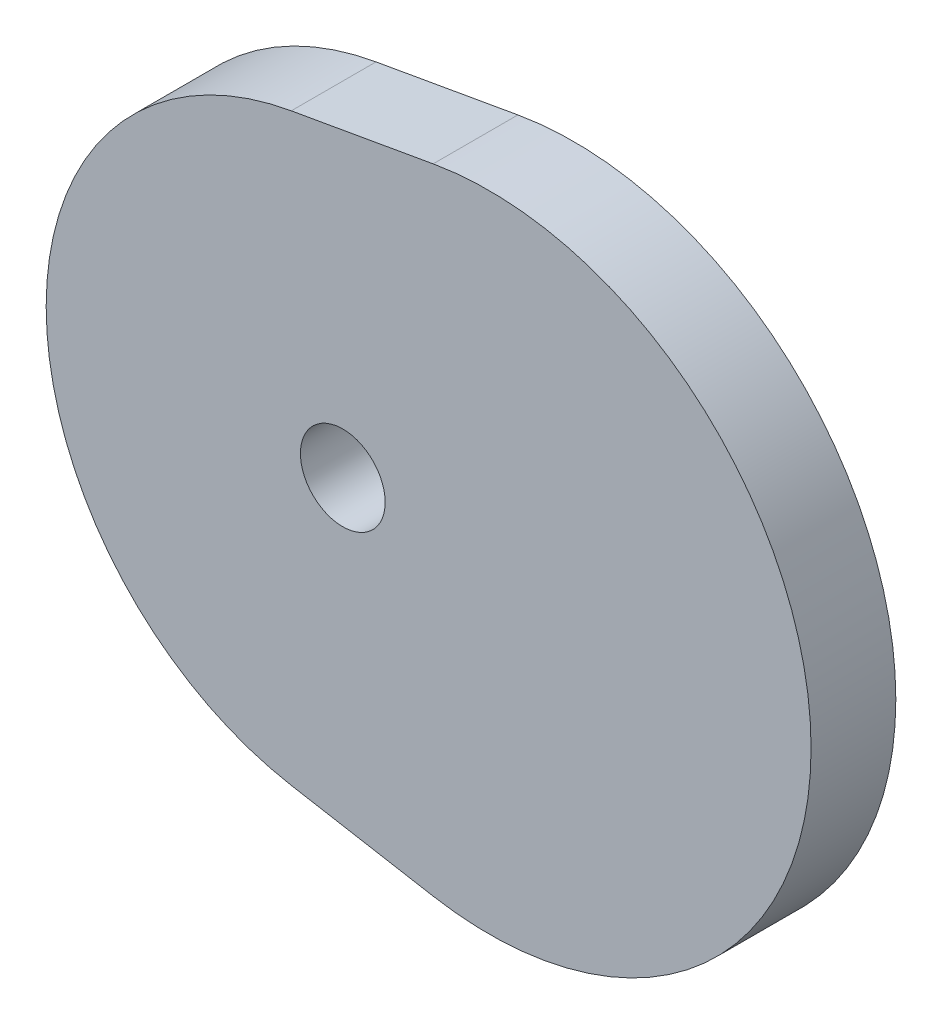
ISO-10303-21;
HEADER;
FILE_DESCRIPTION(('STEP AP214'),'2;1');
FILE_NAME('part.step','',(''),(''),'','','');
FILE_SCHEMA(('AUTOMOTIVE_DESIGN { 1 0 10303 214 1 1 1 1 }'));
ENDSEC;
DATA;
#1=APPLICATION_CONTEXT('core data for automotive mechanical design processes');
#2=APPLICATION_PROTOCOL_DEFINITION('international standard','automotive_design',2000,#1);
#3=PRODUCT_CONTEXT('',#1,'mechanical');
#4=PRODUCT('Part','Part','',(#3));
#5=PRODUCT_RELATED_PRODUCT_CATEGORY('part','',(#4));
#6=PRODUCT_DEFINITION_FORMATION('','',#4);
#7=PRODUCT_DEFINITION_CONTEXT('part definition',#1,'design');
#8=PRODUCT_DEFINITION('design','',#6,#7);
#9=PRODUCT_DEFINITION_SHAPE('','',#8);
#10=(LENGTH_UNIT() NAMED_UNIT(*) SI_UNIT(.MILLI.,.METRE.));
#11=(NAMED_UNIT(*) PLANE_ANGLE_UNIT() SI_UNIT($,.RADIAN.));
#12=(NAMED_UNIT(*) SI_UNIT($,.STERADIAN.) SOLID_ANGLE_UNIT());
#13=UNCERTAINTY_MEASURE_WITH_UNIT(LENGTH_MEASURE(1.E-05),#10,'distance_accuracy_value','');
#14=(GEOMETRIC_REPRESENTATION_CONTEXT(3) GLOBAL_UNCERTAINTY_ASSIGNED_CONTEXT((#13)) GLOBAL_UNIT_ASSIGNED_CONTEXT((#10,
#11,#12)) REPRESENTATION_CONTEXT('',''));
#15=CARTESIAN_POINT('',(0.,0.,0.));
#16=DIRECTION('',(0.,0.,1.));
#17=DIRECTION('',(1.,0.,0.));
#18=AXIS2_PLACEMENT_3D('',#15,#16,#17);
#19=CARTESIAN_POINT('',(8.87362414285556,0.,10.));
#20=DIRECTION('',(0.,0.,-1.));
#21=DIRECTION('',(-1.,0.,0.));
#22=AXIS2_PLACEMENT_3D('',#19,#20,#21);
#23=CYLINDRICAL_SURFACE('',#22,35.);
#24=CARTESIAN_POINT('',(8.87362414285556,0.,0.));
#25=DIRECTION('',(0.,0.,1.));
#26=DIRECTION('',(1.,0.,0.));
#27=AXIS2_PLACEMENT_3D('',#24,#25,#26);
#28=CIRCLE('',#27,35.);
#29=CARTESIAN_POINT('',(2.79593792451287,34.4682713554273,0.));
#30=VERTEX_POINT('',#29);
#31=CARTESIAN_POINT('',(2.79593792451287,-34.4682713554273,0.));
#32=VERTEX_POINT('',#31);
#33=EDGE_CURVE('E99',#30,#32,#28,.T.);
#34=ORIENTED_EDGE('',*,*,#33,.T.);
#35=DIRECTION('',(0.,0.,-1.));
#36=VECTOR('',#35,1.);
#37=CARTESIAN_POINT('',(2.79593792451287,-34.4682713554273,10.));
#38=LINE('',#37,#36);
#39=CARTESIAN_POINT('',(2.79593792451287,-34.4682713554273,10.));
#40=VERTEX_POINT('',#39);
#41=EDGE_CURVE('E11',#40,#32,#38,.T.);
#42=ORIENTED_EDGE('',*,*,#41,.F.);
#43=CARTESIAN_POINT('',(8.87362414285556,0.,10.));
#44=DIRECTION('',(0.,0.,1.));
#45=DIRECTION('',(1.,0.,0.));
#46=AXIS2_PLACEMENT_3D('',#43,#44,#45);
#47=CIRCLE('',#46,35.);
#48=CARTESIAN_POINT('',(2.79593792451287,34.4682713554273,10.));
#49=VERTEX_POINT('',#48);
#50=EDGE_CURVE('E87',#49,#40,#47,.T.);
#51=ORIENTED_EDGE('',*,*,#50,.F.);
#52=DIRECTION('',(0.,0.,-1.));
#53=VECTOR('',#52,1.);
#54=CARTESIAN_POINT('',(2.79593792451287,34.4682713554273,10.));
#55=LINE('',#54,#53);
#56=EDGE_CURVE('E95',#49,#30,#55,.T.);
#57=ORIENTED_EDGE('',*,*,#56,.T.);
#58=EDGE_LOOP('',(#34,#42,#51,#57));
#59=FACE_BOUND('',#58,.T.);
#60=ADVANCED_FACE('F36',(#59),#23,.T.);
#61=CARTESIAN_POINT('',(2.79593792451287,-34.4682713554273,10.));
#62=DIRECTION('',(0.173648177666934,0.984807753012207,0.));
#63=DIRECTION('',(-0.984807753012207,0.173648177666934,0.));
#64=AXIS2_PLACEMENT_3D('',#61,#62,#63);
#65=PLANE('',#64);
#66=DIRECTION('',(0.984807753012207,-0.173648177666934,0.));
#67=VECTOR('',#66,1.);
#68=CARTESIAN_POINT('',(2.79593792451287,-34.4682713554273,0.));
#69=LINE('',#68,#67);
#70=CARTESIAN_POINT('',(19.5376697257204,-37.4202903757651,0.));
#71=VERTEX_POINT('',#70);
#72=EDGE_CURVE('E91',#32,#71,#69,.T.);
#73=ORIENTED_EDGE('',*,*,#72,.T.);
#74=DIRECTION('',(0.,0.,-1.));
#75=VECTOR('',#74,1.);
#76=CARTESIAN_POINT('',(19.5376697257204,-37.4202903757651,10.));
#77=LINE('',#76,#75);
#78=CARTESIAN_POINT('',(19.5376697257204,-37.4202903757651,10.));
#79=VERTEX_POINT('',#78);
#80=EDGE_CURVE('E44',#79,#71,#77,.T.);
#81=ORIENTED_EDGE('',*,*,#80,.F.);
#82=DIRECTION('',(0.984807753012207,-0.173648177666934,0.));
#83=VECTOR('',#82,1.);
#84=CARTESIAN_POINT('',(2.79593792451287,-34.4682713554273,10.));
#85=LINE('',#84,#83);
#86=EDGE_CURVE('E82',#40,#79,#85,.T.);
#87=ORIENTED_EDGE('',*,*,#86,.F.);
#88=ORIENTED_EDGE('',*,*,#41,.T.);
#89=EDGE_LOOP('',(#73,#81,#87,#88));
#90=FACE_BOUND('',#89,.T.);
#91=ADVANCED_FACE('F90',(#90),#65,.F.);
#92=CARTESIAN_POINT('',(26.1358765449132,0.,10.));
#93=DIRECTION('',(0.,0.,-1.));
#94=DIRECTION('',(-1.,0.,0.));
#95=AXIS2_PLACEMENT_3D('',#92,#93,#94);
#96=CYLINDRICAL_SURFACE('',#95,37.997558672044);
#97=CARTESIAN_POINT('',(26.1358765449132,0.,0.));
#98=DIRECTION('',(0.,0.,1.));
#99=DIRECTION('',(-1.,0.,0.));
#100=AXIS2_PLACEMENT_3D('',#97,#98,#99);
#101=CIRCLE('',#100,37.997558672044);
#102=CARTESIAN_POINT('',(19.5376697257204,37.4202903757651,0.));
#103=VERTEX_POINT('',#102);
#104=EDGE_CURVE('E69',#71,#103,#101,.T.);
#105=ORIENTED_EDGE('',*,*,#104,.T.);
#106=DIRECTION('',(0.,0.,-1.));
#107=VECTOR('',#106,1.);
#108=CARTESIAN_POINT('',(19.5376697257204,37.4202903757651,10.));
#109=LINE('',#108,#107);
#110=CARTESIAN_POINT('',(19.5376697257204,37.4202903757651,10.));
#111=VERTEX_POINT('',#110);
#112=EDGE_CURVE('E92',#111,#103,#109,.T.);
#113=ORIENTED_EDGE('',*,*,#112,.F.);
#114=CARTESIAN_POINT('',(26.1358765449132,0.,10.));
#115=DIRECTION('',(0.,0.,1.));
#116=DIRECTION('',(-1.,0.,0.));
#117=AXIS2_PLACEMENT_3D('',#114,#115,#116);
#118=CIRCLE('',#117,37.997558672044);
#119=EDGE_CURVE('E85',#79,#111,#118,.T.);
#120=ORIENTED_EDGE('',*,*,#119,.F.);
#121=ORIENTED_EDGE('',*,*,#80,.T.);
#122=EDGE_LOOP('',(#105,#113,#120,#121));
#123=FACE_BOUND('',#122,.T.);
#124=ADVANCED_FACE('F93',(#123),#96,.T.);
#125=CARTESIAN_POINT('',(2.79593792451287,34.4682713554273,10.));
#126=DIRECTION('',(0.173648177666934,-0.984807753012207,0.));
#127=DIRECTION('',(0.984807753012207,0.173648177666934,0.));
#128=AXIS2_PLACEMENT_3D('',#125,#126,#127);
#129=PLANE('',#128);
#130=DIRECTION('',(-0.984807753012207,-0.173648177666934,0.));
#131=VECTOR('',#130,1.);
#132=CARTESIAN_POINT('',(2.79593792451287,34.4682713554273,0.));
#133=LINE('',#132,#131);
#134=EDGE_CURVE('E75',#103,#30,#133,.T.);
#135=ORIENTED_EDGE('',*,*,#134,.T.);
#136=ORIENTED_EDGE('',*,*,#56,.F.);
#137=DIRECTION('',(-0.984807753012207,-0.173648177666934,0.));
#138=VECTOR('',#137,1.);
#139=CARTESIAN_POINT('',(2.79593792451287,34.4682713554273,10.));
#140=LINE('',#139,#138);
#141=EDGE_CURVE('E52',#111,#49,#140,.T.);
#142=ORIENTED_EDGE('',*,*,#141,.F.);
#143=ORIENTED_EDGE('',*,*,#112,.T.);
#144=EDGE_LOOP('',(#135,#136,#142,#143));
#145=FACE_BOUND('',#144,.T.);
#146=ADVANCED_FACE('F107',(#145),#129,.F.);
#147=CARTESIAN_POINT('',(8.87362414285556,0.,10.));
#148=DIRECTION('',(0.,0.,1.));
#149=DIRECTION('',(1.,0.,0.));
#150=AXIS2_PLACEMENT_3D('',#147,#148,#149);
#151=PLANE('',#150);
#152=CARTESIAN_POINT('',(8.87362414285556,0.,10.));
#153=DIRECTION('',(0.,0.,1.));
#154=DIRECTION('',(1.,0.,0.));
#155=AXIS2_PLACEMENT_3D('',#152,#153,#154);
#156=CIRCLE('',#155,5.);
#157=CARTESIAN_POINT('',(13.8736241428556,0.,10.));
#158=VERTEX_POINT('',#157);
#159=EDGE_CURVE('E113',#158,#158,#156,.T.);
#160=ORIENTED_EDGE('',*,*,#159,.F.);
#161=EDGE_LOOP('',(#160));
#162=FACE_BOUND('',#161,.T.);
#163=ORIENTED_EDGE('',*,*,#50,.T.);
#164=ORIENTED_EDGE('',*,*,#86,.T.);
#165=ORIENTED_EDGE('',*,*,#119,.T.);
#166=ORIENTED_EDGE('',*,*,#141,.T.);
#167=EDGE_LOOP('',(#163,#164,#165,#166));
#168=FACE_BOUND('',#167,.T.);
#169=ADVANCED_FACE('F83',(#162,#168),#151,.T.);
#170=CARTESIAN_POINT('',(8.87362414285556,0.,0.));
#171=DIRECTION('',(0.,0.,1.));
#172=DIRECTION('',(1.,0.,0.));
#173=AXIS2_PLACEMENT_3D('',#170,#171,#172);
#174=PLANE('',#173);
#175=CARTESIAN_POINT('',(8.87362414285556,0.,0.));
#176=DIRECTION('',(0.,0.,1.));
#177=DIRECTION('',(1.,0.,0.));
#178=AXIS2_PLACEMENT_3D('',#175,#176,#177);
#179=CIRCLE('',#178,5.);
#180=CARTESIAN_POINT('',(13.8736241428556,0.,0.));
#181=VERTEX_POINT('',#180);
#182=EDGE_CURVE('E102',#181,#181,#179,.T.);
#183=ORIENTED_EDGE('',*,*,#182,.T.);
#184=EDGE_LOOP('',(#183));
#185=FACE_BOUND('',#184,.T.);
#186=ORIENTED_EDGE('',*,*,#33,.F.);
#187=ORIENTED_EDGE('',*,*,#134,.F.);
#188=ORIENTED_EDGE('',*,*,#104,.F.);
#189=ORIENTED_EDGE('',*,*,#72,.F.);
#190=EDGE_LOOP('',(#186,#187,#188,#189));
#191=FACE_BOUND('',#190,.T.);
#192=ADVANCED_FACE('F110',(#185,#191),#174,.F.);
#193=CARTESIAN_POINT('',(8.87362414285556,0.,0.));
#194=DIRECTION('',(0.,0.,1.));
#195=DIRECTION('',(1.,0.,0.));
#196=AXIS2_PLACEMENT_3D('',#193,#194,#195);
#197=CYLINDRICAL_SURFACE('',#196,5.);
#198=ORIENTED_EDGE('',*,*,#182,.F.);
#199=EDGE_LOOP('',(#198));
#200=FACE_BOUND('',#199,.T.);
#201=ORIENTED_EDGE('',*,*,#159,.T.);
#202=EDGE_LOOP('',(#201));
#203=FACE_BOUND('',#202,.T.);
#204=ADVANCED_FACE('F120',(#200,#203),#197,.F.);
#205=CLOSED_SHELL('',(#60,#91,#124,#146,#169,#192,#204));
#206=MANIFOLD_SOLID_BREP('B2',#205);
#207=ADVANCED_BREP_SHAPE_REPRESENTATION('',(#18,#206),#14);
#208=SHAPE_DEFINITION_REPRESENTATION(#9,#207);
ENDSEC;
END-ISO-10303-21;
